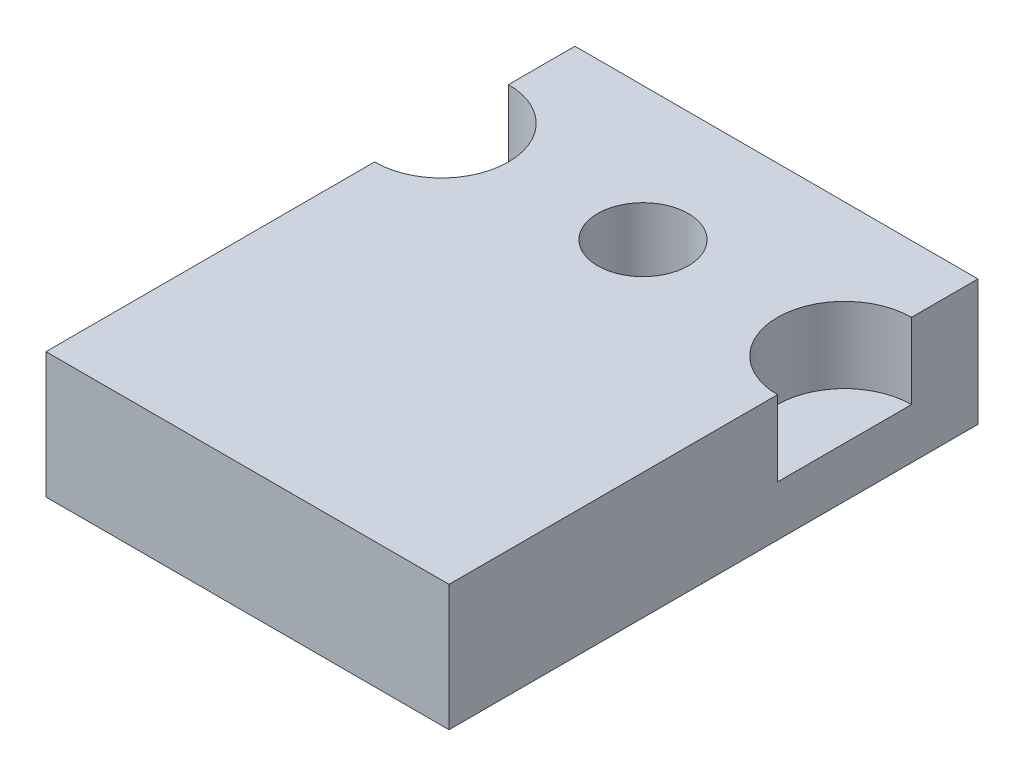
ISO-10303-21;
HEADER;
FILE_DESCRIPTION(('STEP AP214'),'2;1');
FILE_NAME('part.step','',(''),(''),'','','');
FILE_SCHEMA(('AUTOMOTIVE_DESIGN { 1 0 10303 214 1 1 1 1 }'));
ENDSEC;
DATA;
#1=APPLICATION_CONTEXT('core data for automotive mechanical design processes');
#2=APPLICATION_PROTOCOL_DEFINITION('international standard','automotive_design',2000,#1);
#3=PRODUCT_CONTEXT('',#1,'mechanical');
#4=PRODUCT('Part','Part','',(#3));
#5=PRODUCT_RELATED_PRODUCT_CATEGORY('part','',(#4));
#6=PRODUCT_DEFINITION_FORMATION('','',#4);
#7=PRODUCT_DEFINITION_CONTEXT('part definition',#1,'design');
#8=PRODUCT_DEFINITION('design','',#6,#7);
#9=PRODUCT_DEFINITION_SHAPE('','',#8);
#10=(LENGTH_UNIT() NAMED_UNIT(*) SI_UNIT(.MILLI.,.METRE.));
#11=(NAMED_UNIT(*) PLANE_ANGLE_UNIT() SI_UNIT($,.RADIAN.));
#12=(NAMED_UNIT(*) SI_UNIT($,.STERADIAN.) SOLID_ANGLE_UNIT());
#13=UNCERTAINTY_MEASURE_WITH_UNIT(LENGTH_MEASURE(1.E-05),#10,'distance_accuracy_value','');
#14=(GEOMETRIC_REPRESENTATION_CONTEXT(3) GLOBAL_UNCERTAINTY_ASSIGNED_CONTEXT((#13)) GLOBAL_UNIT_ASSIGNED_CONTEXT((#10,
#11,#12)) REPRESENTATION_CONTEXT('',''));
#15=CARTESIAN_POINT('',(0.,0.,0.));
#16=DIRECTION('',(0.,0.,1.));
#17=DIRECTION('',(1.,0.,0.));
#18=AXIS2_PLACEMENT_3D('',#15,#16,#17);
#19=CARTESIAN_POINT('',(0.,5.,0.));
#20=DIRECTION('',(0.,-1.,0.));
#21=DIRECTION('',(0.,0.,-1.));
#22=AXIS2_PLACEMENT_3D('',#19,#20,#21);
#23=PLANE('',#22);
#24=DIRECTION('',(0.,0.,-1.));
#25=VECTOR('',#24,1.);
#26=CARTESIAN_POINT('',(8.,5.,10.5));
#27=LINE('',#26,#25);
#28=CARTESIAN_POINT('',(8.,5.,10.5));
#29=VERTEX_POINT('',#28);
#30=CARTESIAN_POINT('',(8.,5.,-2.54));
#31=VERTEX_POINT('',#30);
#32=EDGE_CURVE('E108',#29,#31,#27,.T.);
#33=ORIENTED_EDGE('',*,*,#32,.T.);
#34=CARTESIAN_POINT('',(8.,5.,-5.2));
#35=DIRECTION('',(0.,1.,0.));
#36=DIRECTION('',(0.,0.,1.));
#37=AXIS2_PLACEMENT_3D('',#34,#35,#36);
#38=CIRCLE('',#37,2.66);
#39=CARTESIAN_POINT('',(8.,5.,-7.86));
#40=VERTEX_POINT('',#39);
#41=EDGE_CURVE('E97',#40,#31,#38,.T.);
#42=ORIENTED_EDGE('',*,*,#41,.F.);
#43=CARTESIAN_POINT('',(8.,5.,-10.5));
#44=VERTEX_POINT('',#43);
#45=EDGE_CURVE('E115',#40,#44,#27,.T.);
#46=ORIENTED_EDGE('',*,*,#45,.T.);
#47=DIRECTION('',(-1.,0.,0.));
#48=VECTOR('',#47,1.);
#49=CARTESIAN_POINT('',(-8.,5.,-10.5));
#50=LINE('',#49,#48);
#51=CARTESIAN_POINT('',(-8.,5.,-10.5));
#52=VERTEX_POINT('',#51);
#53=EDGE_CURVE('E114',#44,#52,#50,.T.);
#54=ORIENTED_EDGE('',*,*,#53,.T.);
#55=DIRECTION('',(0.,0.,1.));
#56=VECTOR('',#55,1.);
#57=CARTESIAN_POINT('',(-8.,5.,10.5));
#58=LINE('',#57,#56);
#59=CARTESIAN_POINT('',(-8.,5.,-7.86));
#60=VERTEX_POINT('',#59);
#61=EDGE_CURVE('E124',#52,#60,#58,.T.);
#62=ORIENTED_EDGE('',*,*,#61,.T.);
#63=CARTESIAN_POINT('',(-8.,5.,-5.2));
#64=DIRECTION('',(0.,1.,0.));
#65=DIRECTION('',(0.,0.,1.));
#66=AXIS2_PLACEMENT_3D('',#63,#64,#65);
#67=CIRCLE('',#66,2.66);
#68=CARTESIAN_POINT('',(-8.,5.,-2.54));
#69=VERTEX_POINT('',#68);
#70=EDGE_CURVE('E167',#69,#60,#67,.T.);
#71=ORIENTED_EDGE('',*,*,#70,.F.);
#72=CARTESIAN_POINT('',(-8.,5.,10.5));
#73=VERTEX_POINT('',#72);
#74=EDGE_CURVE('E117',#69,#73,#58,.T.);
#75=ORIENTED_EDGE('',*,*,#74,.T.);
#76=DIRECTION('',(1.,0.,0.));
#77=VECTOR('',#76,1.);
#78=CARTESIAN_POINT('',(-8.,5.,10.5));
#79=LINE('',#78,#77);
#80=EDGE_CURVE('E112',#73,#29,#79,.T.);
#81=ORIENTED_EDGE('',*,*,#80,.T.);
#82=EDGE_LOOP('',(#33,#42,#46,#54,#62,#71,#75,#81));
#83=FACE_BOUND('',#82,.T.);
#84=CARTESIAN_POINT('',(0.,5.,-5.2));
#85=DIRECTION('',(0.,1.,0.));
#86=DIRECTION('',(0.,0.,1.));
#87=AXIS2_PLACEMENT_3D('',#84,#85,#86);
#88=CIRCLE('',#87,1.8);
#89=CARTESIAN_POINT('',(0.,5.,-3.4));
#90=VERTEX_POINT('',#89);
#91=EDGE_CURVE('E133',#90,#90,#88,.T.);
#92=ORIENTED_EDGE('',*,*,#91,.F.);
#93=EDGE_LOOP('',(#92));
#94=FACE_BOUND('',#93,.T.);
#95=ADVANCED_FACE('F33',(#83,#94),#23,.F.);
#96=CARTESIAN_POINT('',(0.,0.,0.));
#97=DIRECTION('',(0.,-1.,0.));
#98=DIRECTION('',(0.,0.,-1.));
#99=AXIS2_PLACEMENT_3D('',#96,#97,#98);
#100=PLANE('',#99);
#101=DIRECTION('',(0.,0.,-1.));
#102=VECTOR('',#101,1.);
#103=CARTESIAN_POINT('',(8.,0.,10.5));
#104=LINE('',#103,#102);
#105=CARTESIAN_POINT('',(8.,0.,10.5));
#106=VERTEX_POINT('',#105);
#107=CARTESIAN_POINT('',(8.,0.,-10.5));
#108=VERTEX_POINT('',#107);
#109=EDGE_CURVE('E129',#106,#108,#104,.T.);
#110=ORIENTED_EDGE('',*,*,#109,.F.);
#111=DIRECTION('',(1.,0.,0.));
#112=VECTOR('',#111,1.);
#113=CARTESIAN_POINT('',(-8.,0.,10.5));
#114=LINE('',#113,#112);
#115=CARTESIAN_POINT('',(-8.,0.,10.5));
#116=VERTEX_POINT('',#115);
#117=EDGE_CURVE('E119',#116,#106,#114,.T.);
#118=ORIENTED_EDGE('',*,*,#117,.F.);
#119=DIRECTION('',(0.,0.,1.));
#120=VECTOR('',#119,1.);
#121=CARTESIAN_POINT('',(-8.,0.,10.5));
#122=LINE('',#121,#120);
#123=CARTESIAN_POINT('',(-8.,0.,-10.5));
#124=VERTEX_POINT('',#123);
#125=EDGE_CURVE('E135',#124,#116,#122,.T.);
#126=ORIENTED_EDGE('',*,*,#125,.F.);
#127=DIRECTION('',(-1.,0.,0.));
#128=VECTOR('',#127,1.);
#129=CARTESIAN_POINT('',(-8.,0.,-10.5));
#130=LINE('',#129,#128);
#131=EDGE_CURVE('E132',#108,#124,#130,.T.);
#132=ORIENTED_EDGE('',*,*,#131,.F.);
#133=EDGE_LOOP('',(#110,#118,#126,#132));
#134=FACE_BOUND('',#133,.T.);
#135=CARTESIAN_POINT('',(0.,0.,-5.2));
#136=DIRECTION('',(0.,1.,0.));
#137=DIRECTION('',(0.,0.,1.));
#138=AXIS2_PLACEMENT_3D('',#135,#136,#137);
#139=CIRCLE('',#138,1.8);
#140=CARTESIAN_POINT('',(0.,0.,-3.4));
#141=VERTEX_POINT('',#140);
#142=EDGE_CURVE('E121',#141,#141,#139,.T.);
#143=ORIENTED_EDGE('',*,*,#142,.T.);
#144=EDGE_LOOP('',(#143));
#145=FACE_BOUND('',#144,.T.);
#146=ADVANCED_FACE('F177',(#134,#145),#100,.T.);
#147=CARTESIAN_POINT('',(8.,5.,10.5));
#148=DIRECTION('',(-1.,0.,0.));
#149=DIRECTION('',(0.,0.,1.));
#150=AXIS2_PLACEMENT_3D('',#147,#148,#149);
#151=PLANE('',#150);
#152=DIRECTION('',(0.,0.,-1.));
#153=VECTOR('',#152,1.);
#154=CARTESIAN_POINT('',(8.,2.,10.5));
#155=LINE('',#154,#153);
#156=CARTESIAN_POINT('',(8.,2.,-2.54));
#157=VERTEX_POINT('',#156);
#158=CARTESIAN_POINT('',(8.,2.,-7.86));
#159=VERTEX_POINT('',#158);
#160=EDGE_CURVE('E109',#157,#159,#155,.T.);
#161=ORIENTED_EDGE('',*,*,#160,.F.);
#162=DIRECTION('',(0.,1.,0.));
#163=VECTOR('',#162,1.);
#164=CARTESIAN_POINT('',(8.,2.,-2.54));
#165=LINE('',#164,#163);
#166=EDGE_CURVE('E11',#157,#31,#165,.T.);
#167=ORIENTED_EDGE('',*,*,#166,.T.);
#168=ORIENTED_EDGE('',*,*,#32,.F.);
#169=DIRECTION('',(0.,-1.,0.));
#170=VECTOR('',#169,1.);
#171=CARTESIAN_POINT('',(8.,5.,10.5));
#172=LINE('',#171,#170);
#173=EDGE_CURVE('E128',#29,#106,#172,.T.);
#174=ORIENTED_EDGE('',*,*,#173,.T.);
#175=ORIENTED_EDGE('',*,*,#109,.T.);
#176=DIRECTION('',(0.,-1.,0.));
#177=VECTOR('',#176,1.);
#178=CARTESIAN_POINT('',(8.,5.,-10.5));
#179=LINE('',#178,#177);
#180=EDGE_CURVE('E145',#44,#108,#179,.T.);
#181=ORIENTED_EDGE('',*,*,#180,.F.);
#182=ORIENTED_EDGE('',*,*,#45,.F.);
#183=DIRECTION('',(0.,1.,0.));
#184=VECTOR('',#183,1.);
#185=CARTESIAN_POINT('',(8.,2.,-7.86));
#186=LINE('',#185,#184);
#187=EDGE_CURVE('E41',#40,#159,#186,.F.);
#188=ORIENTED_EDGE('',*,*,#187,.T.);
#189=EDGE_LOOP('',(#161,#167,#168,#174,#175,#181,#182,#188));
#190=FACE_BOUND('',#189,.T.);
#191=ADVANCED_FACE('F35',(#190),#151,.F.);
#192=CARTESIAN_POINT('',(-8.,5.,-10.5));
#193=DIRECTION('',(0.,0.,1.));
#194=DIRECTION('',(1.,0.,0.));
#195=AXIS2_PLACEMENT_3D('',#192,#193,#194);
#196=PLANE('',#195);
#197=ORIENTED_EDGE('',*,*,#131,.T.);
#198=DIRECTION('',(0.,-1.,0.));
#199=VECTOR('',#198,1.);
#200=CARTESIAN_POINT('',(-8.,5.,-10.5));
#201=LINE('',#200,#199);
#202=EDGE_CURVE('E142',#52,#124,#201,.T.);
#203=ORIENTED_EDGE('',*,*,#202,.F.);
#204=ORIENTED_EDGE('',*,*,#53,.F.);
#205=ORIENTED_EDGE('',*,*,#180,.T.);
#206=EDGE_LOOP('',(#197,#203,#204,#205));
#207=FACE_BOUND('',#206,.T.);
#208=ADVANCED_FACE('F160',(#207),#196,.F.);
#209=CARTESIAN_POINT('',(-8.,5.,10.5));
#210=DIRECTION('',(1.,0.,0.));
#211=DIRECTION('',(0.,0.,-1.));
#212=AXIS2_PLACEMENT_3D('',#209,#210,#211);
#213=PLANE('',#212);
#214=DIRECTION('',(0.,0.,1.));
#215=VECTOR('',#214,1.);
#216=CARTESIAN_POINT('',(-8.,2.,10.5));
#217=LINE('',#216,#215);
#218=CARTESIAN_POINT('',(-8.,2.,-7.86));
#219=VERTEX_POINT('',#218);
#220=CARTESIAN_POINT('',(-8.,2.,-2.54));
#221=VERTEX_POINT('',#220);
#222=EDGE_CURVE('E148',#219,#221,#217,.T.);
#223=ORIENTED_EDGE('',*,*,#222,.F.);
#224=DIRECTION('',(0.,1.,0.));
#225=VECTOR('',#224,1.);
#226=CARTESIAN_POINT('',(-8.,2.,-7.86));
#227=LINE('',#226,#225);
#228=EDGE_CURVE('E153',#219,#60,#227,.T.);
#229=ORIENTED_EDGE('',*,*,#228,.T.);
#230=ORIENTED_EDGE('',*,*,#61,.F.);
#231=ORIENTED_EDGE('',*,*,#202,.T.);
#232=ORIENTED_EDGE('',*,*,#125,.T.);
#233=DIRECTION('',(0.,-1.,0.));
#234=VECTOR('',#233,1.);
#235=CARTESIAN_POINT('',(-8.,5.,10.5));
#236=LINE('',#235,#234);
#237=EDGE_CURVE('E139',#73,#116,#236,.T.);
#238=ORIENTED_EDGE('',*,*,#237,.F.);
#239=ORIENTED_EDGE('',*,*,#74,.F.);
#240=DIRECTION('',(0.,1.,0.));
#241=VECTOR('',#240,1.);
#242=CARTESIAN_POINT('',(-8.,2.,-2.54));
#243=LINE('',#242,#241);
#244=EDGE_CURVE('E150',#69,#221,#243,.F.);
#245=ORIENTED_EDGE('',*,*,#244,.T.);
#246=EDGE_LOOP('',(#223,#229,#230,#231,#232,#238,#239,#245));
#247=FACE_BOUND('',#246,.T.);
#248=ADVANCED_FACE('F165',(#247),#213,.F.);
#249=CARTESIAN_POINT('',(-8.,5.,10.5));
#250=DIRECTION('',(0.,0.,-1.));
#251=DIRECTION('',(-1.,0.,0.));
#252=AXIS2_PLACEMENT_3D('',#249,#250,#251);
#253=PLANE('',#252);
#254=ORIENTED_EDGE('',*,*,#117,.T.);
#255=ORIENTED_EDGE('',*,*,#173,.F.);
#256=ORIENTED_EDGE('',*,*,#80,.F.);
#257=ORIENTED_EDGE('',*,*,#237,.T.);
#258=EDGE_LOOP('',(#254,#255,#256,#257));
#259=FACE_BOUND('',#258,.T.);
#260=ADVANCED_FACE('F174',(#259),#253,.F.);
#261=CARTESIAN_POINT('',(0.,5.,-5.2));
#262=DIRECTION('',(0.,-1.,0.));
#263=DIRECTION('',(0.,0.,-1.));
#264=AXIS2_PLACEMENT_3D('',#261,#262,#263);
#265=CYLINDRICAL_SURFACE('',#264,1.8);
#266=ORIENTED_EDGE('',*,*,#91,.T.);
#267=EDGE_LOOP('',(#266));
#268=FACE_BOUND('',#267,.T.);
#269=ORIENTED_EDGE('',*,*,#142,.F.);
#270=EDGE_LOOP('',(#269));
#271=FACE_BOUND('',#270,.T.);
#272=ADVANCED_FACE('F189',(#268,#271),#265,.F.);
#273=CARTESIAN_POINT('',(-8.,2.,-5.2));
#274=DIRECTION('',(0.,1.,0.));
#275=DIRECTION('',(0.,0.,1.));
#276=AXIS2_PLACEMENT_3D('',#273,#274,#275);
#277=CYLINDRICAL_SURFACE('',#276,2.66);
#278=CARTESIAN_POINT('',(-8.,2.,-5.2));
#279=DIRECTION('',(0.,1.,0.));
#280=DIRECTION('',(0.,0.,1.));
#281=AXIS2_PLACEMENT_3D('',#278,#279,#280);
#282=CIRCLE('',#281,2.66);
#283=EDGE_CURVE('E54',#221,#219,#282,.T.);
#284=ORIENTED_EDGE('',*,*,#283,.F.);
#285=ORIENTED_EDGE('',*,*,#244,.F.);
#286=ORIENTED_EDGE('',*,*,#70,.T.);
#287=ORIENTED_EDGE('',*,*,#228,.F.);
#288=EDGE_LOOP('',(#284,#285,#286,#287));
#289=FACE_BOUND('',#288,.T.);
#290=ADVANCED_FACE('F231',(#289),#277,.F.);
#291=CARTESIAN_POINT('',(-8.,2.,-5.2));
#292=DIRECTION('',(0.,1.,0.));
#293=DIRECTION('',(0.,0.,1.));
#294=AXIS2_PLACEMENT_3D('',#291,#292,#293);
#295=PLANE('',#294);
#296=ORIENTED_EDGE('',*,*,#222,.T.);
#297=ORIENTED_EDGE('',*,*,#283,.T.);
#298=EDGE_LOOP('',(#296,#297));
#299=FACE_BOUND('',#298,.T.);
#300=ADVANCED_FACE('F243',(#299),#295,.T.);
#301=CARTESIAN_POINT('',(8.,2.,-5.2));
#302=DIRECTION('',(0.,1.,0.));
#303=DIRECTION('',(0.,0.,1.));
#304=AXIS2_PLACEMENT_3D('',#301,#302,#303);
#305=CYLINDRICAL_SURFACE('',#304,2.66);
#306=CARTESIAN_POINT('',(8.,2.,-5.2));
#307=DIRECTION('',(0.,1.,0.));
#308=DIRECTION('',(0.,0.,1.));
#309=AXIS2_PLACEMENT_3D('',#306,#307,#308);
#310=CIRCLE('',#309,2.66);
#311=EDGE_CURVE('E47',#159,#157,#310,.T.);
#312=ORIENTED_EDGE('',*,*,#311,.F.);
#313=ORIENTED_EDGE('',*,*,#187,.F.);
#314=ORIENTED_EDGE('',*,*,#41,.T.);
#315=ORIENTED_EDGE('',*,*,#166,.F.);
#316=EDGE_LOOP('',(#312,#313,#314,#315));
#317=FACE_BOUND('',#316,.T.);
#318=ADVANCED_FACE('F98',(#317),#305,.F.);
#319=CARTESIAN_POINT('',(8.,2.,-5.2));
#320=DIRECTION('',(0.,1.,0.));
#321=DIRECTION('',(0.,0.,1.));
#322=AXIS2_PLACEMENT_3D('',#319,#320,#321);
#323=PLANE('',#322);
#324=ORIENTED_EDGE('',*,*,#160,.T.);
#325=ORIENTED_EDGE('',*,*,#311,.T.);
#326=EDGE_LOOP('',(#324,#325));
#327=FACE_BOUND('',#326,.T.);
#328=ADVANCED_FACE('F254',(#327),#323,.T.);
#329=CLOSED_SHELL('',(#95,#146,#191,#208,#248,#260,#272,#290,#300,#318,#328));
#330=MANIFOLD_SOLID_BREP('B2',#329);
#331=ADVANCED_BREP_SHAPE_REPRESENTATION('',(#18,#330),#14);
#332=SHAPE_DEFINITION_REPRESENTATION(#9,#331);
ENDSEC;
END-ISO-10303-21;
